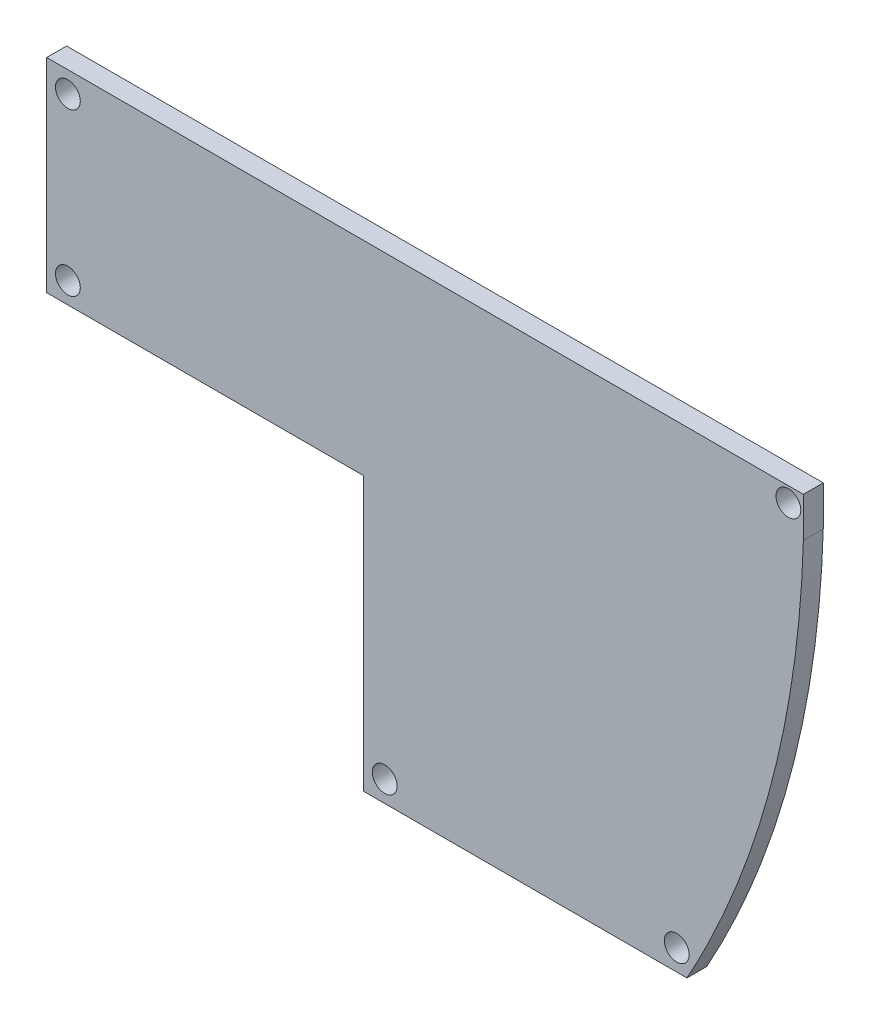
ISO-10303-21;
HEADER;
FILE_DESCRIPTION(('STEP AP214'),'2;1');
FILE_NAME('part.step','',(''),(''),'','','');
FILE_SCHEMA(('AUTOMOTIVE_DESIGN { 1 0 10303 214 1 1 1 1 }'));
ENDSEC;
DATA;
#1=APPLICATION_CONTEXT('core data for automotive mechanical design processes');
#2=APPLICATION_PROTOCOL_DEFINITION('international standard','automotive_design',2000,#1);
#3=PRODUCT_CONTEXT('',#1,'mechanical');
#4=PRODUCT('Part','Part','',(#3));
#5=PRODUCT_RELATED_PRODUCT_CATEGORY('part','',(#4));
#6=PRODUCT_DEFINITION_FORMATION('','',#4);
#7=PRODUCT_DEFINITION_CONTEXT('part definition',#1,'design');
#8=PRODUCT_DEFINITION('design','',#6,#7);
#9=PRODUCT_DEFINITION_SHAPE('','',#8);
#10=(LENGTH_UNIT() NAMED_UNIT(*) SI_UNIT(.MILLI.,.METRE.));
#11=(NAMED_UNIT(*) PLANE_ANGLE_UNIT() SI_UNIT($,.RADIAN.));
#12=(NAMED_UNIT(*) SI_UNIT($,.STERADIAN.) SOLID_ANGLE_UNIT());
#13=UNCERTAINTY_MEASURE_WITH_UNIT(LENGTH_MEASURE(1.E-05),#10,'distance_accuracy_value','');
#14=(GEOMETRIC_REPRESENTATION_CONTEXT(3) GLOBAL_UNCERTAINTY_ASSIGNED_CONTEXT((#13)) GLOBAL_UNIT_ASSIGNED_CONTEXT((#10,
#11,#12)) REPRESENTATION_CONTEXT('',''));
#15=CARTESIAN_POINT('',(0.,0.,0.));
#16=DIRECTION('',(0.,0.,1.));
#17=DIRECTION('',(1.,0.,0.));
#18=AXIS2_PLACEMENT_3D('',#15,#16,#17);
#19=CARTESIAN_POINT('',(-29.3508135315749,-20.6461954709303,1.6));
#20=DIRECTION('',(0.,0.,-1.));
#21=DIRECTION('',(-1.,0.,0.));
#22=AXIS2_PLACEMENT_3D('',#19,#20,#21);
#23=PLANE('',#22);
#24=DIRECTION('',(0.,-1.,0.));
#25=VECTOR('',#24,1.);
#26=CARTESIAN_POINT('',(-87.7000000000001,0.699999999999989,1.6));
#27=LINE('',#26,#25);
#28=CARTESIAN_POINT('',(-87.7000000000001,0.699999999999989,1.6));
#29=VERTEX_POINT('',#28);
#30=CARTESIAN_POINT('',(-87.7000000000001,-15.7,1.6));
#31=VERTEX_POINT('',#30);
#32=EDGE_CURVE('E176',#29,#31,#27,.T.);
#33=ORIENTED_EDGE('',*,*,#32,.T.);
#34=DIRECTION('',(1.,0.,0.));
#35=VECTOR('',#34,1.);
#36=CARTESIAN_POINT('',(-87.7000000000001,-15.7,1.6));
#37=LINE('',#36,#35);
#38=CARTESIAN_POINT('',(-62.2000000000001,-15.7,1.6));
#39=VERTEX_POINT('',#38);
#40=EDGE_CURVE('E98',#31,#39,#37,.T.);
#41=ORIENTED_EDGE('',*,*,#40,.T.);
#42=DIRECTION('',(0.,-1.,0.));
#43=VECTOR('',#42,1.);
#44=CARTESIAN_POINT('',(-62.2000000000001,-15.7,1.6));
#45=LINE('',#44,#43);
#46=CARTESIAN_POINT('',(-62.2000000000001,-37.6999999999999,1.6));
#47=VERTEX_POINT('',#46);
#48=EDGE_CURVE('E165',#39,#47,#45,.T.);
#49=ORIENTED_EDGE('',*,*,#48,.T.);
#50=DIRECTION('',(1.,1.59687554851546E-13,0.));
#51=VECTOR('',#50,1.);
#52=CARTESIAN_POINT('',(-62.2000000000001,-37.6999999999999,1.6));
#53=LINE('',#52,#51);
#54=CARTESIAN_POINT('',(-36.1716883240875,-37.6999999999958,1.6));
#55=VERTEX_POINT('',#54);
#56=EDGE_CURVE('E113',#47,#55,#53,.T.);
#57=ORIENTED_EDGE('',*,*,#56,.T.);
#58=CARTESIAN_POINT('',(-26.799999999999,-2.503618713738,1.6));
#59=CARTESIAN_POINT('',(-26.8915436421301,-5.57342870783248,1.6));
#60=CARTESIAN_POINT('',(-27.1402350657331,-8.62156263485999,1.6));
#61=CARTESIAN_POINT('',(-27.770339575011,-13.1583051206778,1.6));
#62=CARTESIAN_POINT('',(-28.0232606136286,-14.6646371382628,1.6));
#63=CARTESIAN_POINT('',(-28.6187158529897,-17.6649404458798,1.6));
#64=CARTESIAN_POINT('',(-28.9616524499263,-19.1601502043432,1.6));
#65=CARTESIAN_POINT('',(-30.129135694872,-23.6182860041045,1.6));
#66=CARTESIAN_POINT('',(-31.0869411585951,-26.5332403900172,1.6));
#67=CARTESIAN_POINT('',(-33.3690246498449,-32.2396480290972,1.6));
#68=CARTESIAN_POINT('',(-34.6848247245174,-35.0102511680334,1.6));
#69=CARTESIAN_POINT('',(-36.1716883240875,-37.6999999999958,1.6));
#70=B_SPLINE_CURVE_WITH_KNOTS('',3,(#58,#59,#60,#61,#62,#63,#64,#65,#66,#67,#68,#69),
.UNSPECIFIED.,.F.,.F.,(4,2,2,2,2,4),(0.,0.25,0.375,0.5,0.75,1.),.UNSPECIFIED.);
#71=CARTESIAN_POINT('',(-26.799999999999,-2.503618713738,1.6));
#72=VERTEX_POINT('',#71);
#73=EDGE_CURVE('E107',#55,#72,#70,.F.);
#74=ORIENTED_EDGE('',*,*,#73,.T.);
#75=DIRECTION('',(-2.90237967188878E-13,1.,0.));
#76=VECTOR('',#75,1.);
#77=CARTESIAN_POINT('',(-26.799999999999,-2.50361871373801,1.6));
#78=LINE('',#77,#76);
#79=CARTESIAN_POINT('',(-26.8,0.7,1.6));
#80=VERTEX_POINT('',#79);
#81=EDGE_CURVE('E114',#72,#80,#78,.T.);
#82=ORIENTED_EDGE('',*,*,#81,.T.);
#83=DIRECTION('',(-1.,0.,0.));
#84=VECTOR('',#83,1.);
#85=CARTESIAN_POINT('',(-26.8,0.7,1.6));
#86=LINE('',#85,#84);
#87=EDGE_CURVE('E59',#80,#29,#86,.T.);
#88=ORIENTED_EDGE('',*,*,#87,.T.);
#89=EDGE_LOOP('',(#33,#41,#49,#57,#74,#82,#88));
#90=FACE_BOUND('',#89,.T.);
#91=CARTESIAN_POINT('',(-86.0000000000001,-1.,1.6));
#92=DIRECTION('',(0.,0.,1.));
#93=DIRECTION('',(1.,0.,0.));
#94=AXIS2_PLACEMENT_3D('',#91,#92,#93);
#95=CIRCLE('',#94,0.999999999999998);
#96=CARTESIAN_POINT('',(-85.0000000000001,-1.,1.6));
#97=VERTEX_POINT('',#96);
#98=EDGE_CURVE('E175',#97,#97,#95,.T.);
#99=ORIENTED_EDGE('',*,*,#98,.F.);
#100=EDGE_LOOP('',(#99));
#101=FACE_BOUND('',#100,.T.);
#102=CARTESIAN_POINT('',(-86.0000000000001,-14.,1.6));
#103=DIRECTION('',(0.,0.,1.));
#104=DIRECTION('',(1.,0.,0.));
#105=AXIS2_PLACEMENT_3D('',#102,#103,#104);
#106=CIRCLE('',#105,0.999999999999998);
#107=CARTESIAN_POINT('',(-85.0000000000001,-14.,1.6));
#108=VERTEX_POINT('',#107);
#109=EDGE_CURVE('E325',#108,#108,#106,.T.);
#110=ORIENTED_EDGE('',*,*,#109,.F.);
#111=EDGE_LOOP('',(#110));
#112=FACE_BOUND('',#111,.T.);
#113=CARTESIAN_POINT('',(-28.0080870807679,-0.508087080768952,1.6));
#114=DIRECTION('',(0.,0.,1.));
#115=DIRECTION('',(1.,0.,0.));
#116=AXIS2_PLACEMENT_3D('',#113,#114,#115);
#117=CIRCLE('',#116,1.);
#118=CARTESIAN_POINT('',(-27.0080870807679,-0.508087080768952,1.6));
#119=VERTEX_POINT('',#118);
#120=EDGE_CURVE('E316',#119,#119,#117,.T.);
#121=ORIENTED_EDGE('',*,*,#120,.F.);
#122=EDGE_LOOP('',(#121));
#123=FACE_BOUND('',#122,.T.);
#124=CARTESIAN_POINT('',(-36.9949773494414,-36.,1.6));
#125=DIRECTION('',(0.,0.,1.));
#126=DIRECTION('',(1.,0.,0.));
#127=AXIS2_PLACEMENT_3D('',#124,#125,#126);
#128=CIRCLE('',#127,0.999999999999998);
#129=CARTESIAN_POINT('',(-35.9949773494414,-36.,1.6));
#130=VERTEX_POINT('',#129);
#131=EDGE_CURVE('E309',#130,#130,#128,.T.);
#132=ORIENTED_EDGE('',*,*,#131,.F.);
#133=EDGE_LOOP('',(#132));
#134=FACE_BOUND('',#133,.T.);
#135=CARTESIAN_POINT('',(-60.5000000000001,-36.,1.6));
#136=DIRECTION('',(0.,0.,1.));
#137=DIRECTION('',(1.,0.,0.));
#138=AXIS2_PLACEMENT_3D('',#135,#136,#137);
#139=CIRCLE('',#138,0.999999999999998);
#140=CARTESIAN_POINT('',(-59.5000000000001,-36.,1.6));
#141=VERTEX_POINT('',#140);
#142=EDGE_CURVE('E303',#141,#141,#139,.T.);
#143=ORIENTED_EDGE('',*,*,#142,.F.);
#144=EDGE_LOOP('',(#143));
#145=FACE_BOUND('',#144,.T.);
#146=ADVANCED_FACE('F39',(#90,#101,#112,#123,#134,#145),#23,.F.);
#147=CARTESIAN_POINT('',(-29.3508135315749,-20.6461954709303,0.));
#148=DIRECTION('',(0.,0.,-1.));
#149=DIRECTION('',(-1.,0.,0.));
#150=AXIS2_PLACEMENT_3D('',#147,#148,#149);
#151=PLANE('',#150);
#152=CARTESIAN_POINT('',(-36.9949773494414,-36.,0.));
#153=DIRECTION('',(0.,0.,1.));
#154=DIRECTION('',(1.,0.,0.));
#155=AXIS2_PLACEMENT_3D('',#152,#153,#154);
#156=CIRCLE('',#155,0.999999999999998);
#157=CARTESIAN_POINT('',(-35.9949773494414,-36.,0.));
#158=VERTEX_POINT('',#157);
#159=EDGE_CURVE('E307',#158,#158,#156,.T.);
#160=ORIENTED_EDGE('',*,*,#159,.T.);
#161=EDGE_LOOP('',(#160));
#162=FACE_BOUND('',#161,.T.);
#163=CARTESIAN_POINT('',(-86.0000000000001,-14.,0.));
#164=DIRECTION('',(0.,0.,1.));
#165=DIRECTION('',(1.,0.,0.));
#166=AXIS2_PLACEMENT_3D('',#163,#164,#165);
#167=CIRCLE('',#166,0.999999999999998);
#168=CARTESIAN_POINT('',(-85.0000000000001,-14.,0.));
#169=VERTEX_POINT('',#168);
#170=EDGE_CURVE('E317',#169,#169,#167,.T.);
#171=ORIENTED_EDGE('',*,*,#170,.T.);
#172=EDGE_LOOP('',(#171));
#173=FACE_BOUND('',#172,.T.);
#174=DIRECTION('',(0.,-1.,0.));
#175=VECTOR('',#174,1.);
#176=CARTESIAN_POINT('',(-87.7000000000001,0.699999999999989,0.));
#177=LINE('',#176,#175);
#178=CARTESIAN_POINT('',(-87.7000000000001,0.699999999999989,0.));
#179=VERTEX_POINT('',#178);
#180=CARTESIAN_POINT('',(-87.7000000000001,-15.7,0.));
#181=VERTEX_POINT('',#180);
#182=EDGE_CURVE('E169',#179,#181,#177,.T.);
#183=ORIENTED_EDGE('',*,*,#182,.F.);
#184=DIRECTION('',(-1.,0.,0.));
#185=VECTOR('',#184,1.);
#186=CARTESIAN_POINT('',(-26.8,0.7,0.));
#187=LINE('',#186,#185);
#188=CARTESIAN_POINT('',(-26.8,0.7,0.));
#189=VERTEX_POINT('',#188);
#190=EDGE_CURVE('E89',#189,#179,#187,.T.);
#191=ORIENTED_EDGE('',*,*,#190,.F.);
#192=DIRECTION('',(-2.90237967188878E-13,1.,0.));
#193=VECTOR('',#192,1.);
#194=CARTESIAN_POINT('',(-26.799999999999,-2.50361871373801,0.));
#195=LINE('',#194,#193);
#196=CARTESIAN_POINT('',(-26.799999999999,-2.503618713738,0.));
#197=VERTEX_POINT('',#196);
#198=EDGE_CURVE('E82',#197,#189,#195,.T.);
#199=ORIENTED_EDGE('',*,*,#198,.F.);
#200=CARTESIAN_POINT('',(-36.1716883240875,-37.6999999999958,0.));
#201=CARTESIAN_POINT('',(-34.6848247245174,-35.0102511680334,0.));
#202=CARTESIAN_POINT('',(-33.3690246498449,-32.2396480290972,0.));
#203=CARTESIAN_POINT('',(-31.0869411585951,-26.5332403900172,0.));
#204=CARTESIAN_POINT('',(-30.129135694872,-23.6182860041045,0.));
#205=CARTESIAN_POINT('',(-28.9616524499263,-19.1601502043432,0.));
#206=CARTESIAN_POINT('',(-28.6187158529897,-17.6649404458798,0.));
#207=CARTESIAN_POINT('',(-28.0232606136286,-14.6646371382628,0.));
#208=CARTESIAN_POINT('',(-27.770339575011,-13.1583051206778,0.));
#209=CARTESIAN_POINT('',(-27.1402350657331,-8.62156263485999,0.));
#210=CARTESIAN_POINT('',(-26.8915436421301,-5.57342870783248,0.));
#211=CARTESIAN_POINT('',(-26.799999999999,-2.503618713738,0.));
#212=B_SPLINE_CURVE_WITH_KNOTS('',3,(#200,#201,#202,#203,#204,#205,#206,#207,#208,#209,#210,
#211),.UNSPECIFIED.,.F.,.F.,(4,2,2,2,2,4),(0.,0.25,0.5,0.625,0.75,1.),.UNSPECIFIED.);
#213=CARTESIAN_POINT('',(-36.1716883240875,-37.6999999999958,0.));
#214=VERTEX_POINT('',#213);
#215=EDGE_CURVE('E122',#214,#197,#212,.T.);
#216=ORIENTED_EDGE('',*,*,#215,.F.);
#217=DIRECTION('',(1.,1.59687554851546E-13,0.));
#218=VECTOR('',#217,1.);
#219=CARTESIAN_POINT('',(-62.2000000000001,-37.6999999999999,0.));
#220=LINE('',#219,#218);
#221=CARTESIAN_POINT('',(-62.2000000000001,-37.6999999999999,0.));
#222=VERTEX_POINT('',#221);
#223=EDGE_CURVE('E178',#222,#214,#220,.T.);
#224=ORIENTED_EDGE('',*,*,#223,.F.);
#225=DIRECTION('',(0.,-1.,0.));
#226=VECTOR('',#225,1.);
#227=CARTESIAN_POINT('',(-62.2000000000001,-15.7,0.));
#228=LINE('',#227,#226);
#229=CARTESIAN_POINT('',(-62.2000000000001,-15.7,0.));
#230=VERTEX_POINT('',#229);
#231=EDGE_CURVE('E173',#230,#222,#228,.T.);
#232=ORIENTED_EDGE('',*,*,#231,.F.);
#233=DIRECTION('',(1.,0.,0.));
#234=VECTOR('',#233,1.);
#235=CARTESIAN_POINT('',(-87.7000000000001,-15.7,0.));
#236=LINE('',#235,#234);
#237=EDGE_CURVE('E171',#181,#230,#236,.T.);
#238=ORIENTED_EDGE('',*,*,#237,.F.);
#239=EDGE_LOOP('',(#183,#191,#199,#216,#224,#232,#238));
#240=FACE_BOUND('',#239,.T.);
#241=CARTESIAN_POINT('',(-86.0000000000001,-1.,0.));
#242=DIRECTION('',(0.,0.,1.));
#243=DIRECTION('',(1.,0.,0.));
#244=AXIS2_PLACEMENT_3D('',#241,#242,#243);
#245=CIRCLE('',#244,0.999999999999998);
#246=CARTESIAN_POINT('',(-85.0000000000001,-1.,0.));
#247=VERTEX_POINT('',#246);
#248=EDGE_CURVE('E324',#247,#247,#245,.T.);
#249=ORIENTED_EDGE('',*,*,#248,.T.);
#250=EDGE_LOOP('',(#249));
#251=FACE_BOUND('',#250,.T.);
#252=CARTESIAN_POINT('',(-28.0080870807679,-0.508087080768952,0.));
#253=DIRECTION('',(0.,0.,1.));
#254=DIRECTION('',(1.,0.,0.));
#255=AXIS2_PLACEMENT_3D('',#252,#253,#254);
#256=CIRCLE('',#255,1.);
#257=CARTESIAN_POINT('',(-27.0080870807679,-0.508087080768952,0.));
#258=VERTEX_POINT('',#257);
#259=EDGE_CURVE('E311',#258,#258,#256,.T.);
#260=ORIENTED_EDGE('',*,*,#259,.T.);
#261=EDGE_LOOP('',(#260));
#262=FACE_BOUND('',#261,.T.);
#263=CARTESIAN_POINT('',(-60.5000000000001,-36.,0.));
#264=DIRECTION('',(0.,0.,1.));
#265=DIRECTION('',(1.,0.,0.));
#266=AXIS2_PLACEMENT_3D('',#263,#264,#265);
#267=CIRCLE('',#266,0.999999999999998);
#268=CARTESIAN_POINT('',(-59.5000000000001,-36.,0.));
#269=VERTEX_POINT('',#268);
#270=EDGE_CURVE('E302',#269,#269,#267,.T.);
#271=ORIENTED_EDGE('',*,*,#270,.T.);
#272=EDGE_LOOP('',(#271));
#273=FACE_BOUND('',#272,.T.);
#274=ADVANCED_FACE('F191',(#162,#173,#240,#251,#262,#273),#151,.T.);
#275=CARTESIAN_POINT('',(-87.7000000000001,0.699999999999989,1.6));
#276=DIRECTION('',(1.,0.,0.));
#277=DIRECTION('',(0.,0.,-1.));
#278=AXIS2_PLACEMENT_3D('',#275,#276,#277);
#279=PLANE('',#278);
#280=ORIENTED_EDGE('',*,*,#182,.T.);
#281=DIRECTION('',(0.,0.,-1.));
#282=VECTOR('',#281,1.);
#283=CARTESIAN_POINT('',(-87.7000000000001,-15.7,1.6));
#284=LINE('',#283,#282);
#285=EDGE_CURVE('E11',#31,#181,#284,.T.);
#286=ORIENTED_EDGE('',*,*,#285,.F.);
#287=ORIENTED_EDGE('',*,*,#32,.F.);
#288=DIRECTION('',(0.,0.,-1.));
#289=VECTOR('',#288,1.);
#290=CARTESIAN_POINT('',(-87.7000000000001,0.699999999999989,1.6));
#291=LINE('',#290,#289);
#292=EDGE_CURVE('E131',#29,#179,#291,.T.);
#293=ORIENTED_EDGE('',*,*,#292,.T.);
#294=EDGE_LOOP('',(#280,#286,#287,#293));
#295=FACE_BOUND('',#294,.T.);
#296=ADVANCED_FACE('F41',(#295),#279,.F.);
#297=CARTESIAN_POINT('',(-87.7000000000001,-15.7,1.6));
#298=DIRECTION('',(0.,1.,0.));
#299=DIRECTION('',(0.,0.,1.));
#300=AXIS2_PLACEMENT_3D('',#297,#298,#299);
#301=PLANE('',#300);
#302=ORIENTED_EDGE('',*,*,#237,.T.);
#303=DIRECTION('',(0.,0.,-1.));
#304=VECTOR('',#303,1.);
#305=CARTESIAN_POINT('',(-62.2000000000001,-15.7,1.6));
#306=LINE('',#305,#304);
#307=EDGE_CURVE('E47',#39,#230,#306,.T.);
#308=ORIENTED_EDGE('',*,*,#307,.F.);
#309=ORIENTED_EDGE('',*,*,#40,.F.);
#310=ORIENTED_EDGE('',*,*,#285,.T.);
#311=EDGE_LOOP('',(#302,#308,#309,#310));
#312=FACE_BOUND('',#311,.T.);
#313=ADVANCED_FACE('F234',(#312),#301,.F.);
#314=CARTESIAN_POINT('',(-62.2000000000001,-15.7,1.6));
#315=DIRECTION('',(1.,0.,0.));
#316=DIRECTION('',(0.,0.,-1.));
#317=AXIS2_PLACEMENT_3D('',#314,#315,#316);
#318=PLANE('',#317);
#319=ORIENTED_EDGE('',*,*,#231,.T.);
#320=DIRECTION('',(0.,0.,-1.));
#321=VECTOR('',#320,1.);
#322=CARTESIAN_POINT('',(-62.2000000000001,-37.6999999999999,1.6));
#323=LINE('',#322,#321);
#324=EDGE_CURVE('E182',#47,#222,#323,.T.);
#325=ORIENTED_EDGE('',*,*,#324,.F.);
#326=ORIENTED_EDGE('',*,*,#48,.F.);
#327=ORIENTED_EDGE('',*,*,#307,.T.);
#328=EDGE_LOOP('',(#319,#325,#326,#327));
#329=FACE_BOUND('',#328,.T.);
#330=ADVANCED_FACE('F187',(#329),#318,.F.);
#331=CARTESIAN_POINT('',(-62.2000000000001,-37.6999999999999,1.6));
#332=DIRECTION('',(-1.59687554851546E-13,1.,0.));
#333=DIRECTION('',(-1.,-1.59687554851546E-13,0.));
#334=AXIS2_PLACEMENT_3D('',#331,#332,#333);
#335=PLANE('',#334);
#336=ORIENTED_EDGE('',*,*,#223,.T.);
#337=DIRECTION('',(0.,0.,-1.));
#338=VECTOR('',#337,1.);
#339=CARTESIAN_POINT('',(-36.1716883240875,-37.6999999999958,1.6));
#340=LINE('',#339,#338);
#341=EDGE_CURVE('E127',#55,#214,#340,.T.);
#342=ORIENTED_EDGE('',*,*,#341,.F.);
#343=ORIENTED_EDGE('',*,*,#56,.F.);
#344=ORIENTED_EDGE('',*,*,#324,.T.);
#345=EDGE_LOOP('',(#336,#342,#343,#344));
#346=FACE_BOUND('',#345,.T.);
#347=ADVANCED_FACE('F153',(#346),#335,.F.);
#348=CARTESIAN_POINT('',(-36.1716883240875,-37.6999999999958,1.6));
#349=CARTESIAN_POINT('',(-34.6848247245174,-35.0102511680334,1.6));
#350=CARTESIAN_POINT('',(-33.3690246498449,-32.2396480290972,1.6));
#351=CARTESIAN_POINT('',(-31.0869411585951,-26.5332403900172,1.6));
#352=CARTESIAN_POINT('',(-30.129135694872,-23.6182860041045,1.6));
#353=CARTESIAN_POINT('',(-28.9616524499263,-19.1601502043432,1.6));
#354=CARTESIAN_POINT('',(-28.6187158529897,-17.6649404458798,1.6));
#355=CARTESIAN_POINT('',(-28.0232606136286,-14.6646371382628,1.6));
#356=CARTESIAN_POINT('',(-27.770339575011,-13.1583051206778,1.6));
#357=CARTESIAN_POINT('',(-27.1402350657331,-8.62156263485999,1.6));
#358=CARTESIAN_POINT('',(-26.8915436421301,-5.57342870783248,1.6));
#359=CARTESIAN_POINT('',(-26.799999999999,-2.503618713738,1.6));
#360=B_SPLINE_CURVE_WITH_KNOTS('',3,(#348,#349,#350,#351,#352,#353,#354,#355,#356,#357,#358,
#359),.UNSPECIFIED.,.F.,.F.,(4,2,2,2,2,4),(0.,0.25,0.5,0.625,0.75,1.),.UNSPECIFIED.);
#361=DIRECTION('',(0.,0.,-1.));
#362=VECTOR('',#361,1.);
#363=SURFACE_OF_LINEAR_EXTRUSION('',#360,#362);
#364=ORIENTED_EDGE('',*,*,#215,.T.);
#365=DIRECTION('',(0.,0.,-1.));
#366=VECTOR('',#365,1.);
#367=CARTESIAN_POINT('',(-26.799999999999,-2.503618713738,1.6));
#368=LINE('',#367,#366);
#369=EDGE_CURVE('E123',#72,#197,#368,.T.);
#370=ORIENTED_EDGE('',*,*,#369,.F.);
#371=ORIENTED_EDGE('',*,*,#73,.F.);
#372=ORIENTED_EDGE('',*,*,#341,.T.);
#373=EDGE_LOOP('',(#364,#370,#371,#372));
#374=FACE_BOUND('',#373,.T.);
#375=ADVANCED_FACE('F125',(#374),#363,.F.);
#376=CARTESIAN_POINT('',(-26.799999999999,-2.50361871373801,1.6));
#377=DIRECTION('',(-1.,-2.90237967188878E-13,0.));
#378=DIRECTION('',(2.90237967188878E-13,-1.,0.));
#379=AXIS2_PLACEMENT_3D('',#376,#377,#378);
#380=PLANE('',#379);
#381=ORIENTED_EDGE('',*,*,#198,.T.);
#382=DIRECTION('',(0.,0.,-1.));
#383=VECTOR('',#382,1.);
#384=CARTESIAN_POINT('',(-26.8,0.7,1.6));
#385=LINE('',#384,#383);
#386=EDGE_CURVE('E130',#80,#189,#385,.T.);
#387=ORIENTED_EDGE('',*,*,#386,.F.);
#388=ORIENTED_EDGE('',*,*,#81,.F.);
#389=ORIENTED_EDGE('',*,*,#369,.T.);
#390=EDGE_LOOP('',(#381,#387,#388,#389));
#391=FACE_BOUND('',#390,.T.);
#392=ADVANCED_FACE('F129',(#391),#380,.F.);
#393=CARTESIAN_POINT('',(-26.8,0.7,1.6));
#394=DIRECTION('',(0.,-1.,0.));
#395=DIRECTION('',(1.,0.,0.));
#396=AXIS2_PLACEMENT_3D('',#393,#394,#395);
#397=PLANE('',#396);
#398=ORIENTED_EDGE('',*,*,#190,.T.);
#399=ORIENTED_EDGE('',*,*,#292,.F.);
#400=ORIENTED_EDGE('',*,*,#87,.F.);
#401=ORIENTED_EDGE('',*,*,#386,.T.);
#402=EDGE_LOOP('',(#398,#399,#400,#401));
#403=FACE_BOUND('',#402,.T.);
#404=ADVANCED_FACE('F213',(#403),#397,.F.);
#405=CARTESIAN_POINT('',(-86.0000000000001,-1.,1.6));
#406=DIRECTION('',(0.,0.,-1.));
#407=DIRECTION('',(-1.,0.,0.));
#408=AXIS2_PLACEMENT_3D('',#405,#406,#407);
#409=CYLINDRICAL_SURFACE('',#408,0.999999999999998);
#410=ORIENTED_EDGE('',*,*,#98,.T.);
#411=EDGE_LOOP('',(#410));
#412=FACE_BOUND('',#411,.T.);
#413=ORIENTED_EDGE('',*,*,#248,.F.);
#414=EDGE_LOOP('',(#413));
#415=FACE_BOUND('',#414,.T.);
#416=ADVANCED_FACE('F214',(#412,#415),#409,.F.);
#417=CARTESIAN_POINT('',(-86.0000000000001,-14.,1.6));
#418=DIRECTION('',(0.,0.,-1.));
#419=DIRECTION('',(-1.,0.,0.));
#420=AXIS2_PLACEMENT_3D('',#417,#418,#419);
#421=CYLINDRICAL_SURFACE('',#420,0.999999999999998);
#422=ORIENTED_EDGE('',*,*,#109,.T.);
#423=EDGE_LOOP('',(#422));
#424=FACE_BOUND('',#423,.T.);
#425=ORIENTED_EDGE('',*,*,#170,.F.);
#426=EDGE_LOOP('',(#425));
#427=FACE_BOUND('',#426,.T.);
#428=ADVANCED_FACE('F219',(#424,#427),#421,.F.);
#429=CARTESIAN_POINT('',(-28.0080870807679,-0.508087080768952,1.6));
#430=DIRECTION('',(0.,0.,-1.));
#431=DIRECTION('',(-1.,0.,0.));
#432=AXIS2_PLACEMENT_3D('',#429,#430,#431);
#433=CYLINDRICAL_SURFACE('',#432,1.);
#434=ORIENTED_EDGE('',*,*,#120,.T.);
#435=EDGE_LOOP('',(#434));
#436=FACE_BOUND('',#435,.T.);
#437=ORIENTED_EDGE('',*,*,#259,.F.);
#438=EDGE_LOOP('',(#437));
#439=FACE_BOUND('',#438,.T.);
#440=ADVANCED_FACE('F275',(#436,#439),#433,.F.);
#441=CARTESIAN_POINT('',(-36.9949773494414,-36.,1.6));
#442=DIRECTION('',(0.,0.,-1.));
#443=DIRECTION('',(-1.,0.,0.));
#444=AXIS2_PLACEMENT_3D('',#441,#442,#443);
#445=CYLINDRICAL_SURFACE('',#444,0.999999999999998);
#446=ORIENTED_EDGE('',*,*,#131,.T.);
#447=EDGE_LOOP('',(#446));
#448=FACE_BOUND('',#447,.T.);
#449=ORIENTED_EDGE('',*,*,#159,.F.);
#450=EDGE_LOOP('',(#449));
#451=FACE_BOUND('',#450,.T.);
#452=ADVANCED_FACE('F278',(#448,#451),#445,.F.);
#453=CARTESIAN_POINT('',(-60.5000000000001,-36.,1.6));
#454=DIRECTION('',(0.,0.,-1.));
#455=DIRECTION('',(-1.,0.,0.));
#456=AXIS2_PLACEMENT_3D('',#453,#454,#455);
#457=CYLINDRICAL_SURFACE('',#456,0.999999999999998);
#458=ORIENTED_EDGE('',*,*,#142,.T.);
#459=EDGE_LOOP('',(#458));
#460=FACE_BOUND('',#459,.T.);
#461=ORIENTED_EDGE('',*,*,#270,.F.);
#462=EDGE_LOOP('',(#461));
#463=FACE_BOUND('',#462,.T.);
#464=ADVANCED_FACE('F286',(#460,#463),#457,.F.);
#465=CLOSED_SHELL('',(#146,#274,#296,#313,#330,#347,#375,#392,#404,#416,#428,#440,#452,#464));
#466=MANIFOLD_SOLID_BREP('B2',#465);
#467=ADVANCED_BREP_SHAPE_REPRESENTATION('',(#18,#466),#14);
#468=SHAPE_DEFINITION_REPRESENTATION(#9,#467);
ENDSEC;
END-ISO-10303-21;
